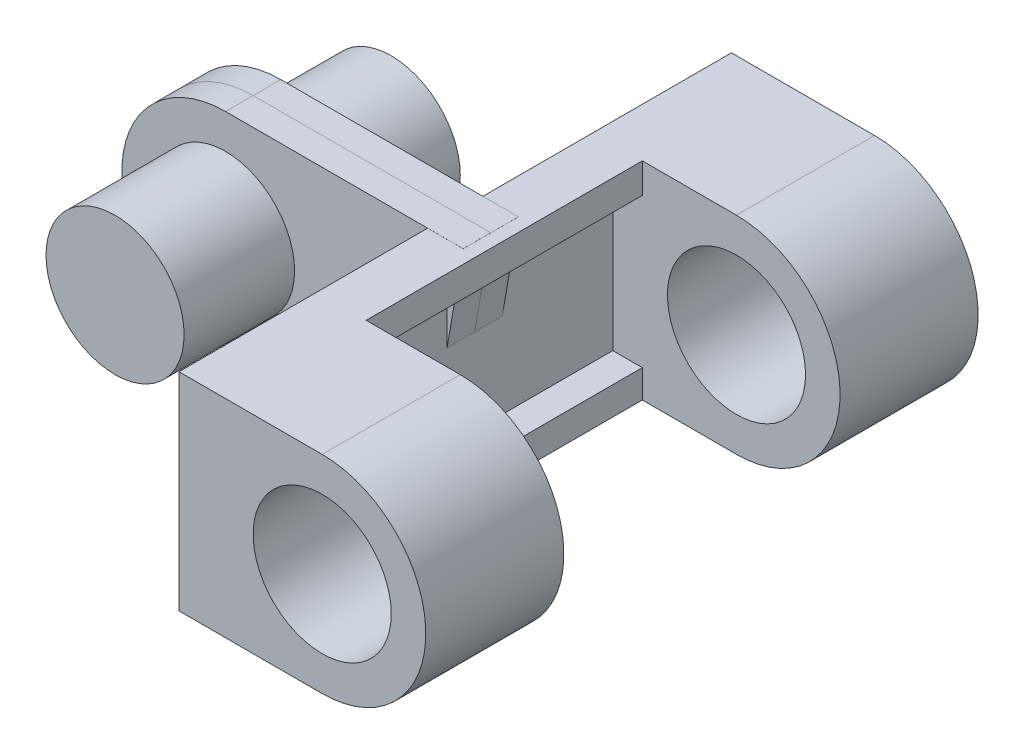
ISO-10303-21;
HEADER;
FILE_DESCRIPTION(('STEP AP214'),'2;1');
FILE_NAME('part.step','',(''),(''),'','','');
FILE_SCHEMA(('AUTOMOTIVE_DESIGN { 1 0 10303 214 1 1 1 1 }'));
ENDSEC;
DATA;
#1=APPLICATION_CONTEXT('core data for automotive mechanical design processes');
#2=APPLICATION_PROTOCOL_DEFINITION('international standard','automotive_design',2000,#1);
#3=PRODUCT_CONTEXT('',#1,'mechanical');
#4=PRODUCT('Part','Part','',(#3));
#5=PRODUCT_RELATED_PRODUCT_CATEGORY('part','',(#4));
#6=PRODUCT_DEFINITION_FORMATION('','',#4);
#7=PRODUCT_DEFINITION_CONTEXT('part definition',#1,'design');
#8=PRODUCT_DEFINITION('design','',#6,#7);
#9=PRODUCT_DEFINITION_SHAPE('','',#8);
#10=(LENGTH_UNIT() NAMED_UNIT(*) SI_UNIT(.MILLI.,.METRE.));
#11=(NAMED_UNIT(*) PLANE_ANGLE_UNIT() SI_UNIT($,.RADIAN.));
#12=(NAMED_UNIT(*) SI_UNIT($,.STERADIAN.) SOLID_ANGLE_UNIT());
#13=UNCERTAINTY_MEASURE_WITH_UNIT(LENGTH_MEASURE(1.E-05),#10,'distance_accuracy_value','');
#14=(GEOMETRIC_REPRESENTATION_CONTEXT(3) GLOBAL_UNCERTAINTY_ASSIGNED_CONTEXT((#13)) GLOBAL_UNIT_ASSIGNED_CONTEXT((#10,
#11,#12)) REPRESENTATION_CONTEXT('',''));
#15=CARTESIAN_POINT('',(0.,0.,0.));
#16=DIRECTION('',(0.,0.,1.));
#17=DIRECTION('',(1.,0.,0.));
#18=AXIS2_PLACEMENT_3D('',#15,#16,#17);
#19=CARTESIAN_POINT('',(-0.778702826170486,0.75031257365423,1.8));
#20=DIRECTION('',(-0.985526586496553,0.169520934720326,0.));
#21=DIRECTION('',(-0.169520934720326,-0.985526586496553,0.));
#22=AXIS2_PLACEMENT_3D('',#19,#20,#21);
#23=PLANE('',#22);
#24=DIRECTION('',(0.169520934720326,0.985526586496553,0.));
#25=VECTOR('',#24,1.);
#26=CARTESIAN_POINT('',(-0.778702826170486,0.75031257365423,2.));
#27=LINE('',#26,#25);
#28=CARTESIAN_POINT('',(-1.03677236315036,-0.75,2.));
#29=VERTEX_POINT('',#28);
#30=CARTESIAN_POINT('',(-0.778702826170486,0.75031257365423,2.));
#31=VERTEX_POINT('',#30);
#32=EDGE_CURVE('E117',#29,#31,#27,.T.);
#33=ORIENTED_EDGE('',*,*,#32,.F.);
#34=DIRECTION('',(0.,0.,1.));
#35=VECTOR('',#34,1.);
#36=CARTESIAN_POINT('',(-1.03677236315036,-0.75,1.8));
#37=LINE('',#36,#35);
#38=CARTESIAN_POINT('',(-1.03677236315036,-0.75,1.8));
#39=VERTEX_POINT('',#38);
#40=EDGE_CURVE('E116',#39,#29,#37,.T.);
#41=ORIENTED_EDGE('',*,*,#40,.F.);
#42=DIRECTION('',(0.169520934720326,0.985526586496553,0.));
#43=VECTOR('',#42,1.);
#44=CARTESIAN_POINT('',(-0.778702826170486,0.75031257365423,1.8));
#45=LINE('',#44,#43);
#46=CARTESIAN_POINT('',(-0.778702826170486,0.75031257365423,1.8));
#47=VERTEX_POINT('',#46);
#48=EDGE_CURVE('E110',#39,#47,#45,.T.);
#49=ORIENTED_EDGE('',*,*,#48,.T.);
#50=DIRECTION('',(0.,0.,1.));
#51=VECTOR('',#50,1.);
#52=CARTESIAN_POINT('',(-0.778702826170486,0.75031257365423,1.8));
#53=LINE('',#52,#51);
#54=EDGE_CURVE('E58',#47,#31,#53,.T.);
#55=ORIENTED_EDGE('',*,*,#54,.T.);
#56=EDGE_LOOP('',(#33,#41,#49,#55));
#57=FACE_BOUND('',#56,.T.);
#58=ADVANCED_FACE('F50',(#57),#23,.F.);
#59=CARTESIAN_POINT('',(-0.778702826170486,0.75031257365423,1.8));
#60=DIRECTION('',(-9.31375131824583E-05,-0.999999995662702,0.));
#61=DIRECTION('',(0.999999995662702,-9.31375131824583E-05,0.));
#62=AXIS2_PLACEMENT_3D('',#59,#60,#61);
#63=PLANE('',#62);
#64=DIRECTION('',(-0.999999995662702,9.31375131824583E-05,0.));
#65=VECTOR('',#64,1.);
#66=CARTESIAN_POINT('',(-0.778702826170486,0.75031257365423,2.));
#67=LINE('',#66,#65);
#68=CARTESIAN_POINT('',(-2.49993010282153,0.750472884483094,2.));
#69=VERTEX_POINT('',#68);
#70=EDGE_CURVE('E119',#31,#69,#67,.T.);
#71=ORIENTED_EDGE('',*,*,#70,.F.);
#72=ORIENTED_EDGE('',*,*,#54,.F.);
#73=DIRECTION('',(-0.999999995662702,9.31375131824583E-05,0.));
#74=VECTOR('',#73,1.);
#75=CARTESIAN_POINT('',(-0.778702826170486,0.75031257365423,1.8));
#76=LINE('',#75,#74);
#77=CARTESIAN_POINT('',(-2.49993010282153,0.750472884483094,1.8));
#78=VERTEX_POINT('',#77);
#79=EDGE_CURVE('E91',#47,#78,#76,.T.);
#80=ORIENTED_EDGE('',*,*,#79,.T.);
#81=DIRECTION('',(0.,0.,1.));
#82=VECTOR('',#81,1.);
#83=CARTESIAN_POINT('',(-2.49993010282153,0.750472884483094,1.8));
#84=LINE('',#83,#82);
#85=EDGE_CURVE('E100',#78,#69,#84,.T.);
#86=ORIENTED_EDGE('',*,*,#85,.T.);
#87=EDGE_LOOP('',(#71,#72,#80,#86));
#88=FACE_BOUND('',#87,.T.);
#89=ADVANCED_FACE('F107',(#88),#63,.F.);
#90=CARTESIAN_POINT('',(-2.5,0.,1.8));
#91=DIRECTION('',(0.,0.,1.));
#92=DIRECTION('',(-1.,0.,0.));
#93=AXIS2_PLACEMENT_3D('',#90,#91,#92);
#94=CYLINDRICAL_SURFACE('',#93,0.750472887738119);
#95=CARTESIAN_POINT('',(-2.5,0.,2.));
#96=DIRECTION('',(0.,0.,1.));
#97=DIRECTION('',(1.,0.,0.));
#98=AXIS2_PLACEMENT_3D('',#95,#96,#97);
#99=CIRCLE('',#98,0.750472887738119);
#100=CARTESIAN_POINT('',(-2.49975744114154,-0.750472848539633,2.));
#101=VERTEX_POINT('',#100);
#102=EDGE_CURVE('E102',#69,#101,#99,.T.);
#103=ORIENTED_EDGE('',*,*,#102,.F.);
#104=ORIENTED_EDGE('',*,*,#85,.F.);
#105=CARTESIAN_POINT('',(-2.5,0.,1.8));
#106=DIRECTION('',(0.,0.,1.));
#107=DIRECTION('',(1.,0.,0.));
#108=AXIS2_PLACEMENT_3D('',#105,#106,#107);
#109=CIRCLE('',#108,0.750472887738119);
#110=CARTESIAN_POINT('',(-2.49975744114154,-0.750472848539633,1.8));
#111=VERTEX_POINT('',#110);
#112=EDGE_CURVE('E94',#78,#111,#109,.T.);
#113=ORIENTED_EDGE('',*,*,#112,.T.);
#114=DIRECTION('',(0.,0.,1.));
#115=VECTOR('',#114,1.);
#116=CARTESIAN_POINT('',(-2.49975744114154,-0.750472848539633,1.8));
#117=LINE('',#116,#115);
#118=EDGE_CURVE('E105',#111,#101,#117,.T.);
#119=ORIENTED_EDGE('',*,*,#118,.T.);
#120=EDGE_LOOP('',(#103,#104,#113,#119));
#121=FACE_BOUND('',#120,.T.);
#122=ADVANCED_FACE('F101',(#121),#94,.T.);
#123=CARTESIAN_POINT('',(-2.49975744114154,-0.750472848539633,1.8));
#124=DIRECTION('',(-0.00032320802313654,0.999999947768285,0.));
#125=DIRECTION('',(-0.999999947768286,-0.00032320802313654,0.));
#126=AXIS2_PLACEMENT_3D('',#123,#124,#125);
#127=PLANE('',#126);
#128=DIRECTION('',(0.999999947768285,0.00032320802313654,0.));
#129=VECTOR('',#128,1.);
#130=CARTESIAN_POINT('',(-2.49975744114154,-0.750472848539633,2.));
#131=LINE('',#130,#129);
#132=EDGE_CURVE('E80',#101,#29,#131,.T.);
#133=ORIENTED_EDGE('',*,*,#132,.F.);
#134=ORIENTED_EDGE('',*,*,#118,.F.);
#135=DIRECTION('',(0.999999947768285,0.00032320802313654,0.));
#136=VECTOR('',#135,1.);
#137=CARTESIAN_POINT('',(-2.49975744114154,-0.750472848539633,1.8));
#138=LINE('',#137,#136);
#139=EDGE_CURVE('E66',#111,#39,#138,.T.);
#140=ORIENTED_EDGE('',*,*,#139,.T.);
#141=ORIENTED_EDGE('',*,*,#40,.T.);
#142=EDGE_LOOP('',(#133,#134,#140,#141));
#143=FACE_BOUND('',#142,.T.);
#144=ADVANCED_FACE('F140',(#143),#127,.F.);
#145=CARTESIAN_POINT('',(-2.5,0.,1.8));
#146=DIRECTION('',(0.,0.,-1.));
#147=DIRECTION('',(1.,0.,0.));
#148=AXIS2_PLACEMENT_3D('',#145,#146,#147);
#149=PLANE('',#148);
#150=ORIENTED_EDGE('',*,*,#48,.F.);
#151=ORIENTED_EDGE('',*,*,#139,.F.);
#152=ORIENTED_EDGE('',*,*,#112,.F.);
#153=ORIENTED_EDGE('',*,*,#79,.F.);
#154=EDGE_LOOP('',(#150,#151,#152,#153));
#155=FACE_BOUND('',#154,.T.);
#156=ADVANCED_FACE('F96',(#155),#149,.T.);
#157=CARTESIAN_POINT('',(-2.5,0.,2.));
#158=DIRECTION('',(0.,0.,-1.));
#159=DIRECTION('',(1.,0.,0.));
#160=AXIS2_PLACEMENT_3D('',#157,#158,#159);
#161=PLANE('',#160);
#162=CARTESIAN_POINT('',(-2.5,0.,2.));
#163=DIRECTION('',(0.,0.,1.));
#164=DIRECTION('',(1.,0.,0.));
#165=AXIS2_PLACEMENT_3D('',#162,#163,#164);
#166=CIRCLE('',#165,0.5);
#167=CARTESIAN_POINT('',(-2.,0.,2.));
#168=VERTEX_POINT('',#167);
#169=EDGE_CURVE('E12',#168,#168,#166,.F.);
#170=ORIENTED_EDGE('',*,*,#169,.T.);
#171=EDGE_LOOP('',(#170));
#172=FACE_BOUND('',#171,.T.);
#173=ORIENTED_EDGE('',*,*,#32,.T.);
#174=ORIENTED_EDGE('',*,*,#70,.T.);
#175=ORIENTED_EDGE('',*,*,#102,.T.);
#176=ORIENTED_EDGE('',*,*,#132,.T.);
#177=EDGE_LOOP('',(#173,#174,#175,#176));
#178=FACE_BOUND('',#177,.T.);
#179=ADVANCED_FACE('F128',(#172,#178),#161,.F.);
#180=CARTESIAN_POINT('',(-2.5,0.,3.));
#181=DIRECTION('',(0.,0.,-1.));
#182=DIRECTION('',(1.,0.,0.));
#183=AXIS2_PLACEMENT_3D('',#180,#181,#182);
#184=CYLINDRICAL_SURFACE('',#183,0.5);
#185=CARTESIAN_POINT('',(-2.5,0.,3.));
#186=DIRECTION('',(0.,0.,-1.));
#187=DIRECTION('',(-1.,0.,0.));
#188=AXIS2_PLACEMENT_3D('',#185,#186,#187);
#189=CIRCLE('',#188,0.5);
#190=CARTESIAN_POINT('',(-3.,0.,3.));
#191=VERTEX_POINT('',#190);
#192=EDGE_CURVE('E120',#191,#191,#189,.T.);
#193=ORIENTED_EDGE('',*,*,#192,.T.);
#194=EDGE_LOOP('',(#193));
#195=FACE_BOUND('',#194,.T.);
#196=ORIENTED_EDGE('',*,*,#169,.F.);
#197=EDGE_LOOP('',(#196));
#198=FACE_BOUND('',#197,.T.);
#199=ADVANCED_FACE('F130',(#195,#198),#184,.T.);
#200=CARTESIAN_POINT('',(-2.5,0.,3.));
#201=DIRECTION('',(0.,0.,1.));
#202=DIRECTION('',(-1.,0.,0.));
#203=AXIS2_PLACEMENT_3D('',#200,#201,#202);
#204=PLANE('',#203);
#205=ORIENTED_EDGE('',*,*,#192,.F.);
#206=EDGE_LOOP('',(#205));
#207=FACE_BOUND('',#206,.T.);
#208=ADVANCED_FACE('F137',(#207),#204,.T.);
#209=CLOSED_SHELL('',(#58,#89,#122,#144,#156,#179,#199,#208));
#210=MANIFOLD_SOLID_BREP('B2',#209);
#211=CARTESIAN_POINT('',(-0.778702826170486,0.75031257365423,2.2));
#212=DIRECTION('',(-0.985526586496553,0.169520934720326,0.));
#213=DIRECTION('',(-0.169520934720326,-0.985526586496553,0.));
#214=AXIS2_PLACEMENT_3D('',#211,#212,#213);
#215=PLANE('',#214);
#216=DIRECTION('',(0.169520934720326,0.985526586496553,0.));
#217=VECTOR('',#216,1.);
#218=CARTESIAN_POINT('',(-0.778702826170486,0.75031257365423,2.));
#219=LINE('',#218,#217);
#220=CARTESIAN_POINT('',(-1.03677236315036,-0.75,2.));
#221=VERTEX_POINT('',#220);
#222=CARTESIAN_POINT('',(-0.778702826170486,0.75031257365423,2.));
#223=VERTEX_POINT('',#222);
#224=EDGE_CURVE('E279',#221,#223,#219,.T.);
#225=ORIENTED_EDGE('',*,*,#224,.T.);
#226=DIRECTION('',(0.,0.,-1.));
#227=VECTOR('',#226,1.);
#228=CARTESIAN_POINT('',(-0.778702826170486,0.75031257365423,2.2));
#229=LINE('',#228,#227);
#230=CARTESIAN_POINT('',(-0.778702826170486,0.75031257365423,2.2));
#231=VERTEX_POINT('',#230);
#232=EDGE_CURVE('E221',#231,#223,#229,.T.);
#233=ORIENTED_EDGE('',*,*,#232,.F.);
#234=DIRECTION('',(0.169520934720326,0.985526586496553,0.));
#235=VECTOR('',#234,1.);
#236=CARTESIAN_POINT('',(-0.778702826170486,0.75031257365423,2.2));
#237=LINE('',#236,#235);
#238=CARTESIAN_POINT('',(-1.03677236315036,-0.75,2.2));
#239=VERTEX_POINT('',#238);
#240=EDGE_CURVE('E265',#239,#231,#237,.T.);
#241=ORIENTED_EDGE('',*,*,#240,.F.);
#242=DIRECTION('',(0.,0.,-1.));
#243=VECTOR('',#242,1.);
#244=CARTESIAN_POINT('',(-1.03677236315036,-0.75,2.2));
#245=LINE('',#244,#243);
#246=EDGE_CURVE('E275',#239,#221,#245,.T.);
#247=ORIENTED_EDGE('',*,*,#246,.T.);
#248=EDGE_LOOP('',(#225,#233,#241,#247));
#249=FACE_BOUND('',#248,.T.);
#250=ADVANCED_FACE('F213',(#249),#215,.F.);
#251=CARTESIAN_POINT('',(-0.778702826170486,0.75031257365423,2.2));
#252=DIRECTION('',(-9.31375131824583E-05,-0.999999995662702,0.));
#253=DIRECTION('',(0.999999995662702,-9.31375131824583E-05,0.));
#254=AXIS2_PLACEMENT_3D('',#251,#252,#253);
#255=PLANE('',#254);
#256=DIRECTION('',(-0.999999995662702,9.31375131824583E-05,0.));
#257=VECTOR('',#256,1.);
#258=CARTESIAN_POINT('',(-0.778702826170486,0.75031257365423,2.));
#259=LINE('',#258,#257);
#260=CARTESIAN_POINT('',(-2.49993010282153,0.750472884483094,2.));
#261=VERTEX_POINT('',#260);
#262=EDGE_CURVE('E270',#223,#261,#259,.T.);
#263=ORIENTED_EDGE('',*,*,#262,.T.);
#264=DIRECTION('',(0.,0.,-1.));
#265=VECTOR('',#264,1.);
#266=CARTESIAN_POINT('',(-2.49993010282153,0.750472884483094,2.2));
#267=LINE('',#266,#265);
#268=CARTESIAN_POINT('',(-2.49993010282153,0.750472884483094,2.2));
#269=VERTEX_POINT('',#268);
#270=EDGE_CURVE('E268',#269,#261,#267,.T.);
#271=ORIENTED_EDGE('',*,*,#270,.F.);
#272=DIRECTION('',(-0.999999995662702,9.31375131824583E-05,0.));
#273=VECTOR('',#272,1.);
#274=CARTESIAN_POINT('',(-0.778702826170486,0.75031257365423,2.2));
#275=LINE('',#274,#273);
#276=EDGE_CURVE('E260',#231,#269,#275,.T.);
#277=ORIENTED_EDGE('',*,*,#276,.F.);
#278=ORIENTED_EDGE('',*,*,#232,.T.);
#279=EDGE_LOOP('',(#263,#271,#277,#278));
#280=FACE_BOUND('',#279,.T.);
#281=ADVANCED_FACE('F269',(#280),#255,.F.);
#282=CARTESIAN_POINT('',(-2.5,0.,2.2));
#283=DIRECTION('',(0.,0.,-1.));
#284=DIRECTION('',(-1.,0.,0.));
#285=AXIS2_PLACEMENT_3D('',#282,#283,#284);
#286=CYLINDRICAL_SURFACE('',#285,0.750472887738119);
#287=CARTESIAN_POINT('',(-2.5,0.,2.));
#288=DIRECTION('',(0.,0.,1.));
#289=DIRECTION('',(1.,0.,0.));
#290=AXIS2_PLACEMENT_3D('',#287,#288,#289);
#291=CIRCLE('',#290,0.750472887738119);
#292=CARTESIAN_POINT('',(-2.49975744114154,-0.750472848539633,2.));
#293=VERTEX_POINT('',#292);
#294=EDGE_CURVE('E246',#261,#293,#291,.T.);
#295=ORIENTED_EDGE('',*,*,#294,.T.);
#296=DIRECTION('',(0.,0.,-1.));
#297=VECTOR('',#296,1.);
#298=CARTESIAN_POINT('',(-2.49975744114154,-0.750472848539633,2.2));
#299=LINE('',#298,#297);
#300=CARTESIAN_POINT('',(-2.49975744114154,-0.750472848539633,2.2));
#301=VERTEX_POINT('',#300);
#302=EDGE_CURVE('E271',#301,#293,#299,.T.);
#303=ORIENTED_EDGE('',*,*,#302,.F.);
#304=CARTESIAN_POINT('',(-2.5,0.,2.2));
#305=DIRECTION('',(0.,0.,1.));
#306=DIRECTION('',(1.,0.,0.));
#307=AXIS2_PLACEMENT_3D('',#304,#305,#306);
#308=CIRCLE('',#307,0.750472887738119);
#309=EDGE_CURVE('E263',#269,#301,#308,.T.);
#310=ORIENTED_EDGE('',*,*,#309,.F.);
#311=ORIENTED_EDGE('',*,*,#270,.T.);
#312=EDGE_LOOP('',(#295,#303,#310,#311));
#313=FACE_BOUND('',#312,.T.);
#314=ADVANCED_FACE('F273',(#313),#286,.T.);
#315=CARTESIAN_POINT('',(-2.49975744114154,-0.750472848539633,2.2));
#316=DIRECTION('',(-0.00032320802313654,0.999999947768285,0.));
#317=DIRECTION('',(-0.999999947768286,-0.00032320802313654,0.));
#318=AXIS2_PLACEMENT_3D('',#315,#316,#317);
#319=PLANE('',#318);
#320=DIRECTION('',(0.999999947768285,0.00032320802313654,0.));
#321=VECTOR('',#320,1.);
#322=CARTESIAN_POINT('',(-2.49975744114154,-0.750472848539633,2.));
#323=LINE('',#322,#321);
#324=EDGE_CURVE('E252',#293,#221,#323,.T.);
#325=ORIENTED_EDGE('',*,*,#324,.T.);
#326=ORIENTED_EDGE('',*,*,#246,.F.);
#327=DIRECTION('',(0.999999947768285,0.00032320802313654,0.));
#328=VECTOR('',#327,1.);
#329=CARTESIAN_POINT('',(-2.49975744114154,-0.750472848539633,2.2));
#330=LINE('',#329,#328);
#331=EDGE_CURVE('E229',#301,#239,#330,.T.);
#332=ORIENTED_EDGE('',*,*,#331,.F.);
#333=ORIENTED_EDGE('',*,*,#302,.T.);
#334=EDGE_LOOP('',(#325,#326,#332,#333));
#335=FACE_BOUND('',#334,.T.);
#336=ADVANCED_FACE('F302',(#335),#319,.F.);
#337=CARTESIAN_POINT('',(-2.5,0.,2.2));
#338=DIRECTION('',(0.,0.,1.));
#339=DIRECTION('',(1.,0.,0.));
#340=AXIS2_PLACEMENT_3D('',#337,#338,#339);
#341=PLANE('',#340);
#342=ORIENTED_EDGE('',*,*,#240,.T.);
#343=ORIENTED_EDGE('',*,*,#276,.T.);
#344=ORIENTED_EDGE('',*,*,#309,.T.);
#345=ORIENTED_EDGE('',*,*,#331,.T.);
#346=EDGE_LOOP('',(#342,#343,#344,#345));
#347=FACE_BOUND('',#346,.T.);
#348=ADVANCED_FACE('F261',(#347),#341,.T.);
#349=CARTESIAN_POINT('',(-2.5,0.,2.));
#350=DIRECTION('',(0.,0.,1.));
#351=DIRECTION('',(1.,0.,0.));
#352=AXIS2_PLACEMENT_3D('',#349,#350,#351);
#353=PLANE('',#352);
#354=CARTESIAN_POINT('',(-2.5,0.,2.));
#355=DIRECTION('',(0.,0.,1.));
#356=DIRECTION('',(1.,0.,0.));
#357=AXIS2_PLACEMENT_3D('',#354,#355,#356);
#358=CIRCLE('',#357,0.5);
#359=CARTESIAN_POINT('',(-2.,0.,2.));
#360=VERTEX_POINT('',#359);
#361=EDGE_CURVE('E48',#360,#360,#358,.F.);
#362=ORIENTED_EDGE('',*,*,#361,.F.);
#363=EDGE_LOOP('',(#362));
#364=FACE_BOUND('',#363,.T.);
#365=ORIENTED_EDGE('',*,*,#224,.F.);
#366=ORIENTED_EDGE('',*,*,#324,.F.);
#367=ORIENTED_EDGE('',*,*,#294,.F.);
#368=ORIENTED_EDGE('',*,*,#262,.F.);
#369=EDGE_LOOP('',(#365,#366,#367,#368));
#370=FACE_BOUND('',#369,.T.);
#371=ADVANCED_FACE('F290',(#364,#370),#353,.F.);
#372=CARTESIAN_POINT('',(-2.5,0.,1.));
#373=DIRECTION('',(0.,0.,1.));
#374=DIRECTION('',(1.,0.,0.));
#375=AXIS2_PLACEMENT_3D('',#372,#373,#374);
#376=CYLINDRICAL_SURFACE('',#375,0.5);
#377=CARTESIAN_POINT('',(-2.5,0.,1.));
#378=DIRECTION('',(0.,0.,-1.));
#379=DIRECTION('',(-1.,0.,0.));
#380=AXIS2_PLACEMENT_3D('',#377,#378,#379);
#381=CIRCLE('',#380,0.5);
#382=CARTESIAN_POINT('',(-3.,0.,1.));
#383=VERTEX_POINT('',#382);
#384=EDGE_CURVE('E282',#383,#383,#381,.T.);
#385=ORIENTED_EDGE('',*,*,#384,.F.);
#386=EDGE_LOOP('',(#385));
#387=FACE_BOUND('',#386,.T.);
#388=ORIENTED_EDGE('',*,*,#361,.T.);
#389=EDGE_LOOP('',(#388));
#390=FACE_BOUND('',#389,.T.);
#391=ADVANCED_FACE('F292',(#387,#390),#376,.T.);
#392=CARTESIAN_POINT('',(-2.5,0.,1.));
#393=DIRECTION('',(0.,0.,-1.));
#394=DIRECTION('',(-1.,0.,0.));
#395=AXIS2_PLACEMENT_3D('',#392,#393,#394);
#396=PLANE('',#395);
#397=ORIENTED_EDGE('',*,*,#384,.T.);
#398=EDGE_LOOP('',(#397));
#399=FACE_BOUND('',#398,.T.);
#400=ADVANCED_FACE('F299',(#399),#396,.T.);
#401=CLOSED_SHELL('',(#250,#281,#314,#336,#348,#371,#391,#400));
#402=MANIFOLD_SOLID_BREP('B6',#401);
#403=CARTESIAN_POINT('',(0.,0.,1.));
#404=DIRECTION('',(0.,0.,1.));
#405=DIRECTION('',(1.,0.,0.));
#406=AXIS2_PLACEMENT_3D('',#403,#404,#405);
#407=PLANE('',#406);
#408=DIRECTION('',(0.,1.,0.));
#409=VECTOR('',#408,1.);
#410=CARTESIAN_POINT('',(-0.681856945547565,-0.75,1.));
#411=LINE('',#410,#409);
#412=CARTESIAN_POINT('',(-0.681856945547565,-0.75,1.));
#413=VERTEX_POINT('',#412);
#414=CARTESIAN_POINT('',(-0.681856945547565,-0.546810508566601,1.));
#415=VERTEX_POINT('',#414);
#416=EDGE_CURVE('E522',#413,#415,#411,.T.);
#417=ORIENTED_EDGE('',*,*,#416,.F.);
#418=DIRECTION('',(1.,0.,0.));
#419=VECTOR('',#418,1.);
#420=CARTESIAN_POINT('',(-1.03677236315036,-0.75,1.));
#421=LINE('',#420,#419);
#422=CARTESIAN_POINT('',(0.,-0.75,1.));
#423=VERTEX_POINT('',#422);
#424=EDGE_CURVE('E551',#413,#423,#421,.T.);
#425=ORIENTED_EDGE('',*,*,#424,.T.);
#426=CARTESIAN_POINT('',(0.,0.,1.));
#427=DIRECTION('',(0.,0.,1.));
#428=DIRECTION('',(1.,0.,0.));
#429=AXIS2_PLACEMENT_3D('',#426,#427,#428);
#430=CIRCLE('',#429,0.75);
#431=CARTESIAN_POINT('',(0.,0.75,1.));
#432=VERTEX_POINT('',#431);
#433=EDGE_CURVE('E545',#423,#432,#430,.T.);
#434=ORIENTED_EDGE('',*,*,#433,.T.);
#435=DIRECTION('',(-1.,0.,0.));
#436=VECTOR('',#435,1.);
#437=CARTESIAN_POINT('',(-1.03677236315036,0.75,1.));
#438=LINE('',#437,#436);
#439=CARTESIAN_POINT('',(-0.681856945547565,0.75,1.));
#440=VERTEX_POINT('',#439);
#441=EDGE_CURVE('E548',#432,#440,#438,.T.);
#442=ORIENTED_EDGE('',*,*,#441,.T.);
#443=DIRECTION('',(0.,1.,0.));
#444=VECTOR('',#443,1.);
#445=CARTESIAN_POINT('',(-0.681856945547565,0.53354904484415,1.));
#446=LINE('',#445,#444);
#447=CARTESIAN_POINT('',(-0.681856945547565,0.53354904484415,1.));
#448=VERTEX_POINT('',#447);
#449=EDGE_CURVE('E462',#448,#440,#446,.T.);
#450=ORIENTED_EDGE('',*,*,#449,.F.);
#451=DIRECTION('',(1.,0.,0.));
#452=VECTOR('',#451,1.);
#453=CARTESIAN_POINT('',(-0.8957090182804,0.53354904484415,1.));
#454=LINE('',#453,#452);
#455=CARTESIAN_POINT('',(-0.8957090182804,0.53354904484415,1.));
#456=VERTEX_POINT('',#455);
#457=EDGE_CURVE('E518',#456,#448,#454,.T.);
#458=ORIENTED_EDGE('',*,*,#457,.F.);
#459=DIRECTION('',(0.,1.,0.));
#460=VECTOR('',#459,1.);
#461=CARTESIAN_POINT('',(-0.8957090182804,-0.546810508566601,1.));
#462=LINE('',#461,#460);
#463=CARTESIAN_POINT('',(-0.8957090182804,-0.546810508566601,1.));
#464=VERTEX_POINT('',#463);
#465=EDGE_CURVE('E387',#464,#456,#462,.T.);
#466=ORIENTED_EDGE('',*,*,#465,.F.);
#467=DIRECTION('',(-1.,0.,0.));
#468=VECTOR('',#467,1.);
#469=CARTESIAN_POINT('',(-0.681856945547565,-0.546810508566601,1.));
#470=LINE('',#469,#468);
#471=EDGE_CURVE('E382',#415,#464,#470,.T.);
#472=ORIENTED_EDGE('',*,*,#471,.F.);
#473=EDGE_LOOP('',(#417,#425,#434,#442,#450,#458,#466,#472));
#474=FACE_BOUND('',#473,.T.);
#475=CARTESIAN_POINT('',(0.,0.,1.));
#476=DIRECTION('',(0.,0.,1.));
#477=DIRECTION('',(1.,0.,0.));
#478=AXIS2_PLACEMENT_3D('',#475,#476,#477);
#479=CIRCLE('',#478,0.500000000000001);
#480=CARTESIAN_POINT('',(0.500000000000001,0.,1.));
#481=VERTEX_POINT('',#480);
#482=EDGE_CURVE('E539',#481,#481,#479,.T.);
#483=ORIENTED_EDGE('',*,*,#482,.F.);
#484=EDGE_LOOP('',(#483));
#485=FACE_BOUND('',#484,.T.);
#486=ADVANCED_FACE('F367',(#474,#485),#407,.T.);
#487=CARTESIAN_POINT('',(0.,0.,0.));
#488=DIRECTION('',(0.,0.,1.));
#489=DIRECTION('',(1.,0.,0.));
#490=AXIS2_PLACEMENT_3D('',#487,#488,#489);
#491=PLANE('',#490);
#492=CARTESIAN_POINT('',(0.,0.,0.));
#493=DIRECTION('',(0.,0.,1.));
#494=DIRECTION('',(1.,0.,0.));
#495=AXIS2_PLACEMENT_3D('',#492,#493,#494);
#496=CIRCLE('',#495,0.75);
#497=CARTESIAN_POINT('',(0.,-0.75,0.));
#498=VERTEX_POINT('',#497);
#499=CARTESIAN_POINT('',(0.,0.75,0.));
#500=VERTEX_POINT('',#499);
#501=EDGE_CURVE('E542',#498,#500,#496,.T.);
#502=ORIENTED_EDGE('',*,*,#501,.F.);
#503=DIRECTION('',(1.,0.,0.));
#504=VECTOR('',#503,1.);
#505=CARTESIAN_POINT('',(-1.03677236315036,-0.75,0.));
#506=LINE('',#505,#504);
#507=CARTESIAN_POINT('',(-1.03677236315036,-0.75,0.));
#508=VERTEX_POINT('',#507);
#509=EDGE_CURVE('E549',#508,#498,#506,.T.);
#510=ORIENTED_EDGE('',*,*,#509,.F.);
#511=DIRECTION('',(0.,-1.,0.));
#512=VECTOR('',#511,1.);
#513=CARTESIAN_POINT('',(-1.03677236315036,0.75,0.));
#514=LINE('',#513,#512);
#515=CARTESIAN_POINT('',(-1.03677236315036,0.75,0.));
#516=VERTEX_POINT('',#515);
#517=EDGE_CURVE('E558',#516,#508,#514,.T.);
#518=ORIENTED_EDGE('',*,*,#517,.F.);
#519=DIRECTION('',(-1.,0.,0.));
#520=VECTOR('',#519,1.);
#521=CARTESIAN_POINT('',(-1.03677236315036,0.75,0.));
#522=LINE('',#521,#520);
#523=EDGE_CURVE('E556',#500,#516,#522,.T.);
#524=ORIENTED_EDGE('',*,*,#523,.F.);
#525=EDGE_LOOP('',(#502,#510,#518,#524));
#526=FACE_BOUND('',#525,.T.);
#527=CARTESIAN_POINT('',(0.,0.,0.));
#528=DIRECTION('',(0.,0.,1.));
#529=DIRECTION('',(1.,0.,0.));
#530=AXIS2_PLACEMENT_3D('',#527,#528,#529);
#531=CIRCLE('',#530,0.500000000000001);
#532=CARTESIAN_POINT('',(0.500000000000001,0.,0.));
#533=VERTEX_POINT('',#532);
#534=EDGE_CURVE('E538',#533,#533,#531,.T.);
#535=ORIENTED_EDGE('',*,*,#534,.T.);
#536=EDGE_LOOP('',(#535));
#537=FACE_BOUND('',#536,.T.);
#538=ADVANCED_FACE('F573',(#526,#537),#491,.F.);
#539=CARTESIAN_POINT('',(0.,0.,1.));
#540=DIRECTION('',(0.,0.,-1.));
#541=DIRECTION('',(-1.,0.,0.));
#542=AXIS2_PLACEMENT_3D('',#539,#540,#541);
#543=CYLINDRICAL_SURFACE('',#542,0.75);
#544=ORIENTED_EDGE('',*,*,#501,.T.);
#545=DIRECTION('',(0.,0.,-1.));
#546=VECTOR('',#545,1.);
#547=CARTESIAN_POINT('',(0.,0.75,1.));
#548=LINE('',#547,#546);
#549=EDGE_CURVE('E211',#432,#500,#548,.T.);
#550=ORIENTED_EDGE('',*,*,#549,.F.);
#551=ORIENTED_EDGE('',*,*,#433,.F.);
#552=DIRECTION('',(0.,0.,-1.));
#553=VECTOR('',#552,1.);
#554=CARTESIAN_POINT('',(0.,-0.75,1.));
#555=LINE('',#554,#553);
#556=EDGE_CURVE('E553',#423,#498,#555,.T.);
#557=ORIENTED_EDGE('',*,*,#556,.T.);
#558=EDGE_LOOP('',(#544,#550,#551,#557));
#559=FACE_BOUND('',#558,.T.);
#560=ADVANCED_FACE('F369',(#559),#543,.T.);
#561=CARTESIAN_POINT('',(-1.03677236315036,0.75,1.));
#562=DIRECTION('',(0.,-1.,0.));
#563=DIRECTION('',(0.,0.,-1.));
#564=AXIS2_PLACEMENT_3D('',#561,#562,#563);
#565=PLANE('',#564);
#566=ORIENTED_EDGE('',*,*,#523,.T.);
#567=DIRECTION('',(0.,0.,-1.));
#568=VECTOR('',#567,1.);
#569=CARTESIAN_POINT('',(-1.03677236315036,0.75,1.));
#570=LINE('',#569,#568);
#571=CARTESIAN_POINT('',(-1.03677236315036,0.75,4.));
#572=VERTEX_POINT('',#571);
#573=EDGE_CURVE('E375',#572,#516,#570,.T.);
#574=ORIENTED_EDGE('',*,*,#573,.F.);
#575=DIRECTION('',(-1.,0.,0.));
#576=VECTOR('',#575,1.);
#577=CARTESIAN_POINT('',(-1.03677236315036,0.75,4.));
#578=LINE('',#577,#576);
#579=CARTESIAN_POINT('',(0.,0.75,4.));
#580=VERTEX_POINT('',#579);
#581=EDGE_CURVE('E508',#580,#572,#578,.T.);
#582=ORIENTED_EDGE('',*,*,#581,.F.);
#583=DIRECTION('',(0.,0.,1.));
#584=VECTOR('',#583,1.);
#585=CARTESIAN_POINT('',(0.,0.75,3.));
#586=LINE('',#585,#584);
#587=CARTESIAN_POINT('',(0.,0.75,3.));
#588=VERTEX_POINT('',#587);
#589=EDGE_CURVE('E471',#588,#580,#586,.T.);
#590=ORIENTED_EDGE('',*,*,#589,.F.);
#591=DIRECTION('',(-1.,0.,0.));
#592=VECTOR('',#591,1.);
#593=CARTESIAN_POINT('',(-1.03677236315036,0.75,3.));
#594=LINE('',#593,#592);
#595=CARTESIAN_POINT('',(-0.681856945547565,0.75,3.));
#596=VERTEX_POINT('',#595);
#597=EDGE_CURVE('E468',#588,#596,#594,.T.);
#598=ORIENTED_EDGE('',*,*,#597,.T.);
#599=DIRECTION('',(0.,0.,-1.));
#600=VECTOR('',#599,1.);
#601=CARTESIAN_POINT('',(-0.681856945547565,0.75,2.));
#602=LINE('',#601,#600);
#603=EDGE_CURVE('E455',#596,#440,#602,.T.);
#604=ORIENTED_EDGE('',*,*,#603,.T.);
#605=ORIENTED_EDGE('',*,*,#441,.F.);
#606=ORIENTED_EDGE('',*,*,#549,.T.);
#607=EDGE_LOOP('',(#566,#574,#582,#590,#598,#604,#605,#606));
#608=FACE_BOUND('',#607,.T.);
#609=ADVANCED_FACE('F469',(#608),#565,.F.);
#610=CARTESIAN_POINT('',(-1.03677236315036,0.75,1.));
#611=DIRECTION('',(1.,0.,0.));
#612=DIRECTION('',(0.,0.,-1.));
#613=AXIS2_PLACEMENT_3D('',#610,#611,#612);
#614=PLANE('',#613);
#615=ORIENTED_EDGE('',*,*,#517,.T.);
#616=DIRECTION('',(0.,0.,-1.));
#617=VECTOR('',#616,1.);
#618=CARTESIAN_POINT('',(-1.03677236315036,-0.75,1.));
#619=LINE('',#618,#617);
#620=CARTESIAN_POINT('',(-1.03677236315036,-0.75,4.));
#621=VERTEX_POINT('',#620);
#622=EDGE_CURVE('E563',#621,#508,#619,.T.);
#623=ORIENTED_EDGE('',*,*,#622,.F.);
#624=DIRECTION('',(0.,-1.,0.));
#625=VECTOR('',#624,1.);
#626=CARTESIAN_POINT('',(-1.03677236315036,0.75,4.));
#627=LINE('',#626,#625);
#628=EDGE_CURVE('E511',#572,#621,#627,.T.);
#629=ORIENTED_EDGE('',*,*,#628,.F.);
#630=ORIENTED_EDGE('',*,*,#573,.T.);
#631=EDGE_LOOP('',(#615,#623,#629,#630));
#632=FACE_BOUND('',#631,.T.);
#633=ADVANCED_FACE('F569',(#632),#614,.F.);
#634=CARTESIAN_POINT('',(-1.03677236315036,-0.75,1.));
#635=DIRECTION('',(0.,1.,0.));
#636=DIRECTION('',(0.,0.,1.));
#637=AXIS2_PLACEMENT_3D('',#634,#635,#636);
#638=PLANE('',#637);
#639=ORIENTED_EDGE('',*,*,#509,.T.);
#640=ORIENTED_EDGE('',*,*,#556,.F.);
#641=ORIENTED_EDGE('',*,*,#424,.F.);
#642=DIRECTION('',(0.,0.,-1.));
#643=VECTOR('',#642,1.);
#644=CARTESIAN_POINT('',(-0.681856945547565,-0.75,2.));
#645=LINE('',#644,#643);
#646=CARTESIAN_POINT('',(-0.681856945547565,-0.75,3.));
#647=VERTEX_POINT('',#646);
#648=EDGE_CURVE('E465',#647,#413,#645,.T.);
#649=ORIENTED_EDGE('',*,*,#648,.F.);
#650=DIRECTION('',(1.,0.,0.));
#651=VECTOR('',#650,1.);
#652=CARTESIAN_POINT('',(-1.03677236315036,-0.75,3.));
#653=LINE('',#652,#651);
#654=CARTESIAN_POINT('',(0.,-0.75,3.));
#655=VERTEX_POINT('',#654);
#656=EDGE_CURVE('E475',#647,#655,#653,.T.);
#657=ORIENTED_EDGE('',*,*,#656,.T.);
#658=DIRECTION('',(0.,0.,1.));
#659=VECTOR('',#658,1.);
#660=CARTESIAN_POINT('',(0.,-0.75,3.));
#661=LINE('',#660,#659);
#662=CARTESIAN_POINT('',(0.,-0.75,4.));
#663=VERTEX_POINT('',#662);
#664=EDGE_CURVE('E505',#655,#663,#661,.T.);
#665=ORIENTED_EDGE('',*,*,#664,.T.);
#666=DIRECTION('',(1.,0.,0.));
#667=VECTOR('',#666,1.);
#668=CARTESIAN_POINT('',(-1.03677236315036,-0.75,4.));
#669=LINE('',#668,#667);
#670=EDGE_CURVE('E501',#621,#663,#669,.T.);
#671=ORIENTED_EDGE('',*,*,#670,.F.);
#672=ORIENTED_EDGE('',*,*,#622,.T.);
#673=EDGE_LOOP('',(#639,#640,#641,#649,#657,#665,#671,#672));
#674=FACE_BOUND('',#673,.T.);
#675=ADVANCED_FACE('F577',(#674),#638,.F.);
#676=CARTESIAN_POINT('',(0.,0.,1.));
#677=DIRECTION('',(0.,0.,-1.));
#678=DIRECTION('',(-1.,0.,0.));
#679=AXIS2_PLACEMENT_3D('',#676,#677,#678);
#680=CYLINDRICAL_SURFACE('',#679,0.500000000000001);
#681=ORIENTED_EDGE('',*,*,#482,.T.);
#682=EDGE_LOOP('',(#681));
#683=FACE_BOUND('',#682,.T.);
#684=ORIENTED_EDGE('',*,*,#534,.F.);
#685=EDGE_LOOP('',(#684));
#686=FACE_BOUND('',#685,.T.);
#687=ADVANCED_FACE('F614',(#683,#686),#680,.F.);
#688=CARTESIAN_POINT('',(-0.8957090182804,0.53354904484415,2.));
#689=DIRECTION('',(0.,1.,0.));
#690=DIRECTION('',(0.,0.,1.));
#691=AXIS2_PLACEMENT_3D('',#688,#689,#690);
#692=PLANE('',#691);
#693=ORIENTED_EDGE('',*,*,#457,.T.);
#694=DIRECTION('',(0.,0.,-1.));
#695=VECTOR('',#694,1.);
#696=CARTESIAN_POINT('',(-0.681856945547565,0.53354904484415,2.));
#697=LINE('',#696,#695);
#698=CARTESIAN_POINT('',(-0.681856945547565,0.53354904484415,3.));
#699=VERTEX_POINT('',#698);
#700=EDGE_CURVE('E464',#699,#448,#697,.T.);
#701=ORIENTED_EDGE('',*,*,#700,.F.);
#702=DIRECTION('',(1.,0.,0.));
#703=VECTOR('',#702,1.);
#704=CARTESIAN_POINT('',(-0.8957090182804,0.53354904484415,3.));
#705=LINE('',#704,#703);
#706=CARTESIAN_POINT('',(-0.8957090182804,0.53354904484415,3.));
#707=VERTEX_POINT('',#706);
#708=EDGE_CURVE('E483',#707,#699,#705,.T.);
#709=ORIENTED_EDGE('',*,*,#708,.F.);
#710=DIRECTION('',(0.,0.,-1.));
#711=VECTOR('',#710,1.);
#712=CARTESIAN_POINT('',(-0.8957090182804,0.53354904484415,2.));
#713=LINE('',#712,#711);
#714=EDGE_CURVE('E526',#707,#456,#713,.T.);
#715=ORIENTED_EDGE('',*,*,#714,.T.);
#716=EDGE_LOOP('',(#693,#701,#709,#715));
#717=FACE_BOUND('',#716,.T.);
#718=ADVANCED_FACE('F684',(#717),#692,.F.);
#719=CARTESIAN_POINT('',(-0.681856945547565,0.53354904484415,2.));
#720=DIRECTION('',(-1.,0.,0.));
#721=DIRECTION('',(0.,0.,1.));
#722=AXIS2_PLACEMENT_3D('',#719,#720,#721);
#723=PLANE('',#722);
#724=ORIENTED_EDGE('',*,*,#449,.T.);
#725=ORIENTED_EDGE('',*,*,#603,.F.);
#726=DIRECTION('',(0.,1.,0.));
#727=VECTOR('',#726,1.);
#728=CARTESIAN_POINT('',(-0.681856945547565,0.53354904484415,3.));
#729=LINE('',#728,#727);
#730=EDGE_CURVE('E460',#699,#596,#729,.T.);
#731=ORIENTED_EDGE('',*,*,#730,.F.);
#732=ORIENTED_EDGE('',*,*,#700,.T.);
#733=EDGE_LOOP('',(#724,#725,#731,#732));
#734=FACE_BOUND('',#733,.T.);
#735=ADVANCED_FACE('F457',(#734),#723,.F.);
#736=CARTESIAN_POINT('',(-0.681856945547565,-0.75,2.));
#737=DIRECTION('',(-1.,0.,0.));
#738=DIRECTION('',(0.,0.,1.));
#739=AXIS2_PLACEMENT_3D('',#736,#737,#738);
#740=PLANE('',#739);
#741=ORIENTED_EDGE('',*,*,#416,.T.);
#742=DIRECTION('',(0.,0.,-1.));
#743=VECTOR('',#742,1.);
#744=CARTESIAN_POINT('',(-0.681856945547565,-0.546810508566601,2.));
#745=LINE('',#744,#743);
#746=CARTESIAN_POINT('',(-0.681856945547565,-0.546810508566601,3.));
#747=VERTEX_POINT('',#746);
#748=EDGE_CURVE('E532',#747,#415,#745,.T.);
#749=ORIENTED_EDGE('',*,*,#748,.F.);
#750=DIRECTION('',(0.,1.,0.));
#751=VECTOR('',#750,1.);
#752=CARTESIAN_POINT('',(-0.681856945547565,-0.75,3.));
#753=LINE('',#752,#751);
#754=EDGE_CURVE('E484',#647,#747,#753,.T.);
#755=ORIENTED_EDGE('',*,*,#754,.F.);
#756=ORIENTED_EDGE('',*,*,#648,.T.);
#757=EDGE_LOOP('',(#741,#749,#755,#756));
#758=FACE_BOUND('',#757,.T.);
#759=ADVANCED_FACE('F587',(#758),#740,.F.);
#760=CARTESIAN_POINT('',(-0.681856945547565,-0.546810508566601,2.));
#761=DIRECTION('',(0.,-1.,0.));
#762=DIRECTION('',(0.,0.,-1.));
#763=AXIS2_PLACEMENT_3D('',#760,#761,#762);
#764=PLANE('',#763);
#765=ORIENTED_EDGE('',*,*,#471,.T.);
#766=DIRECTION('',(0.,0.,-1.));
#767=VECTOR('',#766,1.);
#768=CARTESIAN_POINT('',(-0.8957090182804,-0.546810508566601,2.));
#769=LINE('',#768,#767);
#770=CARTESIAN_POINT('',(-0.8957090182804,-0.546810508566601,3.));
#771=VERTEX_POINT('',#770);
#772=EDGE_CURVE('E529',#771,#464,#769,.T.);
#773=ORIENTED_EDGE('',*,*,#772,.F.);
#774=DIRECTION('',(-1.,0.,0.));
#775=VECTOR('',#774,1.);
#776=CARTESIAN_POINT('',(-0.681856945547565,-0.546810508566601,3.));
#777=LINE('',#776,#775);
#778=EDGE_CURVE('E486',#747,#771,#777,.T.);
#779=ORIENTED_EDGE('',*,*,#778,.F.);
#780=ORIENTED_EDGE('',*,*,#748,.T.);
#781=EDGE_LOOP('',(#765,#773,#779,#780));
#782=FACE_BOUND('',#781,.T.);
#783=ADVANCED_FACE('F657',(#782),#764,.F.);
#784=CARTESIAN_POINT('',(-0.8957090182804,-0.546810508566601,2.));
#785=DIRECTION('',(-1.,0.,0.));
#786=DIRECTION('',(0.,0.,1.));
#787=AXIS2_PLACEMENT_3D('',#784,#785,#786);
#788=PLANE('',#787);
#789=ORIENTED_EDGE('',*,*,#465,.T.);
#790=ORIENTED_EDGE('',*,*,#714,.F.);
#791=DIRECTION('',(0.,1.,0.));
#792=VECTOR('',#791,1.);
#793=CARTESIAN_POINT('',(-0.8957090182804,-0.546810508566601,3.));
#794=LINE('',#793,#792);
#795=EDGE_CURVE('E492',#771,#707,#794,.T.);
#796=ORIENTED_EDGE('',*,*,#795,.F.);
#797=ORIENTED_EDGE('',*,*,#772,.T.);
#798=EDGE_LOOP('',(#789,#790,#796,#797));
#799=FACE_BOUND('',#798,.T.);
#800=ADVANCED_FACE('F651',(#799),#788,.F.);
#801=CARTESIAN_POINT('',(0.,0.,3.));
#802=DIRECTION('',(0.,0.,-1.));
#803=DIRECTION('',(1.,0.,0.));
#804=AXIS2_PLACEMENT_3D('',#801,#802,#803);
#805=PLANE('',#804);
#806=ORIENTED_EDGE('',*,*,#754,.T.);
#807=ORIENTED_EDGE('',*,*,#778,.T.);
#808=ORIENTED_EDGE('',*,*,#795,.T.);
#809=ORIENTED_EDGE('',*,*,#708,.T.);
#810=ORIENTED_EDGE('',*,*,#730,.T.);
#811=ORIENTED_EDGE('',*,*,#597,.F.);
#812=CARTESIAN_POINT('',(0.,0.,3.));
#813=DIRECTION('',(0.,0.,1.));
#814=DIRECTION('',(1.,0.,0.));
#815=AXIS2_PLACEMENT_3D('',#812,#813,#814);
#816=CIRCLE('',#815,0.75);
#817=EDGE_CURVE('E476',#655,#588,#816,.T.);
#818=ORIENTED_EDGE('',*,*,#817,.F.);
#819=ORIENTED_EDGE('',*,*,#656,.F.);
#820=EDGE_LOOP('',(#806,#807,#808,#809,#810,#811,#818,#819));
#821=FACE_BOUND('',#820,.T.);
#822=CARTESIAN_POINT('',(0.,0.,3.));
#823=DIRECTION('',(0.,0.,1.));
#824=DIRECTION('',(1.,0.,0.));
#825=AXIS2_PLACEMENT_3D('',#822,#823,#824);
#826=CIRCLE('',#825,0.500000000000001);
#827=CARTESIAN_POINT('',(0.500000000000001,0.,3.));
#828=VERTEX_POINT('',#827);
#829=EDGE_CURVE('E495',#828,#828,#826,.T.);
#830=ORIENTED_EDGE('',*,*,#829,.T.);
#831=EDGE_LOOP('',(#830));
#832=FACE_BOUND('',#831,.T.);
#833=ADVANCED_FACE('F479',(#821,#832),#805,.T.);
#834=CARTESIAN_POINT('',(0.,0.,4.));
#835=DIRECTION('',(0.,0.,-1.));
#836=DIRECTION('',(1.,0.,0.));
#837=AXIS2_PLACEMENT_3D('',#834,#835,#836);
#838=PLANE('',#837);
#839=CARTESIAN_POINT('',(0.,0.,4.));
#840=DIRECTION('',(0.,0.,1.));
#841=DIRECTION('',(1.,0.,0.));
#842=AXIS2_PLACEMENT_3D('',#839,#840,#841);
#843=CIRCLE('',#842,0.75);
#844=EDGE_CURVE('E498',#663,#580,#843,.T.);
#845=ORIENTED_EDGE('',*,*,#844,.T.);
#846=ORIENTED_EDGE('',*,*,#581,.T.);
#847=ORIENTED_EDGE('',*,*,#628,.T.);
#848=ORIENTED_EDGE('',*,*,#670,.T.);
#849=EDGE_LOOP('',(#845,#846,#847,#848));
#850=FACE_BOUND('',#849,.T.);
#851=CARTESIAN_POINT('',(0.,0.,4.));
#852=DIRECTION('',(0.,0.,1.));
#853=DIRECTION('',(1.,0.,0.));
#854=AXIS2_PLACEMENT_3D('',#851,#852,#853);
#855=CIRCLE('',#854,0.500000000000001);
#856=CARTESIAN_POINT('',(0.500000000000001,0.,4.));
#857=VERTEX_POINT('',#856);
#858=EDGE_CURVE('E494',#857,#857,#855,.T.);
#859=ORIENTED_EDGE('',*,*,#858,.F.);
#860=EDGE_LOOP('',(#859));
#861=FACE_BOUND('',#860,.T.);
#862=ADVANCED_FACE('F592',(#850,#861),#838,.F.);
#863=CARTESIAN_POINT('',(0.,0.,3.));
#864=DIRECTION('',(0.,0.,1.));
#865=DIRECTION('',(-1.,0.,0.));
#866=AXIS2_PLACEMENT_3D('',#863,#864,#865);
#867=CYLINDRICAL_SURFACE('',#866,0.75);
#868=ORIENTED_EDGE('',*,*,#844,.F.);
#869=ORIENTED_EDGE('',*,*,#664,.F.);
#870=ORIENTED_EDGE('',*,*,#817,.T.);
#871=ORIENTED_EDGE('',*,*,#589,.T.);
#872=EDGE_LOOP('',(#868,#869,#870,#871));
#873=FACE_BOUND('',#872,.T.);
#874=ADVANCED_FACE('F594',(#873),#867,.T.);
#875=CARTESIAN_POINT('',(0.,0.,3.));
#876=DIRECTION('',(0.,0.,1.));
#877=DIRECTION('',(-1.,0.,0.));
#878=AXIS2_PLACEMENT_3D('',#875,#876,#877);
#879=CYLINDRICAL_SURFACE('',#878,0.500000000000001);
#880=ORIENTED_EDGE('',*,*,#829,.F.);
#881=EDGE_LOOP('',(#880));
#882=FACE_BOUND('',#881,.T.);
#883=ORIENTED_EDGE('',*,*,#858,.T.);
#884=EDGE_LOOP('',(#883));
#885=FACE_BOUND('',#884,.T.);
#886=ADVANCED_FACE('F596',(#882,#885),#879,.F.);
#887=CLOSED_SHELL('',(#486,#538,#560,#609,#633,#675,#687,#718,#735,#759,#783,#800,#833,#862,
#874,#886));
#888=MANIFOLD_SOLID_BREP('B42',#887);
#889=ADVANCED_BREP_SHAPE_REPRESENTATION('',(#18,#210,#402,#888),#14);
#890=SHAPE_DEFINITION_REPRESENTATION(#9,#889);
ENDSEC;
END-ISO-10303-21;
